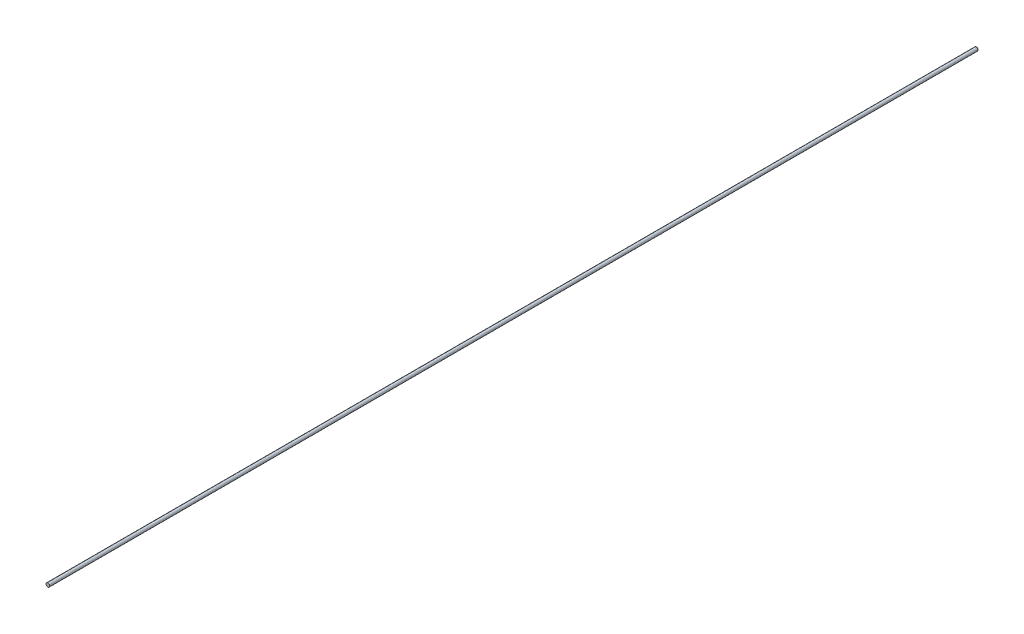
ISO-10303-21;
HEADER;
FILE_DESCRIPTION(('STEP AP214'),'2;1');
FILE_NAME('part.step','',(''),(''),'','','');
FILE_SCHEMA(('AUTOMOTIVE_DESIGN { 1 0 10303 214 1 1 1 1 }'));
ENDSEC;
DATA;
#1=APPLICATION_CONTEXT('core data for automotive mechanical design processes');
#2=APPLICATION_PROTOCOL_DEFINITION('international standard','automotive_design',2000,#1);
#3=PRODUCT_CONTEXT('',#1,'mechanical');
#4=PRODUCT('Part','Part','',(#3));
#5=PRODUCT_RELATED_PRODUCT_CATEGORY('part','',(#4));
#6=PRODUCT_DEFINITION_FORMATION('','',#4);
#7=PRODUCT_DEFINITION_CONTEXT('part definition',#1,'design');
#8=PRODUCT_DEFINITION('design','',#6,#7);
#9=PRODUCT_DEFINITION_SHAPE('','',#8);
#10=(LENGTH_UNIT() NAMED_UNIT(*) SI_UNIT(.MILLI.,.METRE.));
#11=(NAMED_UNIT(*) PLANE_ANGLE_UNIT() SI_UNIT($,.RADIAN.));
#12=(NAMED_UNIT(*) SI_UNIT($,.STERADIAN.) SOLID_ANGLE_UNIT());
#13=UNCERTAINTY_MEASURE_WITH_UNIT(LENGTH_MEASURE(1.E-05),#10,'distance_accuracy_value','');
#14=(GEOMETRIC_REPRESENTATION_CONTEXT(3) GLOBAL_UNCERTAINTY_ASSIGNED_CONTEXT((#13)) GLOBAL_UNIT_ASSIGNED_CONTEXT((#10,
#11,#12)) REPRESENTATION_CONTEXT('',''));
#15=CARTESIAN_POINT('',(0.,0.,0.));
#16=DIRECTION('',(0.,0.,1.));
#17=DIRECTION('',(1.,0.,0.));
#18=AXIS2_PLACEMENT_3D('',#15,#16,#17);
#19=CARTESIAN_POINT('',(0.,0.,1034.05));
#20=DIRECTION('',(0.,0.,-1.));
#21=DIRECTION('',(-1.,0.,0.));
#22=AXIS2_PLACEMENT_3D('',#19,#20,#21);
#23=CYLINDRICAL_SURFACE('',#22,2.);
#24=CARTESIAN_POINT('',(0.,0.,0.38999999999989));
#25=DIRECTION('',(0.,0.,1.));
#26=DIRECTION('',(1.,0.,0.));
#27=AXIS2_PLACEMENT_3D('',#24,#25,#26);
#28=CIRCLE('',#27,1.99999999999989);
#29=CARTESIAN_POINT('',(1.99999999999989,0.,0.38999999999989));
#30=VERTEX_POINT('',#29);
#31=EDGE_CURVE('E44',#30,#30,#28,.T.);
#32=ORIENTED_EDGE('',*,*,#31,.T.);
#33=EDGE_LOOP('',(#32));
#34=FACE_BOUND('',#33,.T.);
#35=CARTESIAN_POINT('',(0.,0.,1034.05));
#36=DIRECTION('',(0.,0.,1.));
#37=DIRECTION('',(1.,0.,0.));
#38=AXIS2_PLACEMENT_3D('',#35,#36,#37);
#39=CIRCLE('',#38,2.);
#40=CARTESIAN_POINT('',(2.,0.,1034.05));
#41=VERTEX_POINT('',#40);
#42=EDGE_CURVE('E10',#41,#41,#39,.T.);
#43=ORIENTED_EDGE('',*,*,#42,.F.);
#44=EDGE_LOOP('',(#43));
#45=FACE_BOUND('',#44,.T.);
#46=ADVANCED_FACE('F38',(#34,#45),#23,.T.);
#47=CARTESIAN_POINT('',(0.,0.,1034.05));
#48=DIRECTION('',(0.,0.,1.));
#49=DIRECTION('',(1.,0.,0.));
#50=AXIS2_PLACEMENT_3D('',#47,#48,#49);
#51=PLANE('',#50);
#52=ORIENTED_EDGE('',*,*,#42,.T.);
#53=EDGE_LOOP('',(#52));
#54=FACE_BOUND('',#53,.T.);
#55=ADVANCED_FACE('F62',(#54),#51,.T.);
#56=CARTESIAN_POINT('',(0.,0.,0.));
#57=DIRECTION('',(0.,0.,1.));
#58=DIRECTION('',(1.,0.,0.));
#59=AXIS2_PLACEMENT_3D('',#56,#57,#58);
#60=CONICAL_SURFACE('',#59,1.61,0.785398163397449);
#61=ORIENTED_EDGE('',*,*,#31,.F.);
#62=EDGE_LOOP('',(#61));
#63=FACE_BOUND('',#62,.T.);
#64=CARTESIAN_POINT('',(0.,0.,0.));
#65=DIRECTION('',(0.,0.,1.));
#66=DIRECTION('',(1.,0.,0.));
#67=AXIS2_PLACEMENT_3D('',#64,#65,#66);
#68=CIRCLE('',#67,1.61);
#69=CARTESIAN_POINT('',(1.61,0.,0.));
#70=VERTEX_POINT('',#69);
#71=EDGE_CURVE('E48',#70,#70,#68,.T.);
#72=ORIENTED_EDGE('',*,*,#71,.T.);
#73=EDGE_LOOP('',(#72));
#74=FACE_BOUND('',#73,.T.);
#75=ADVANCED_FACE('F55',(#63,#74),#60,.T.);
#76=CARTESIAN_POINT('',(0.,0.,0.));
#77=DIRECTION('',(0.,0.,1.));
#78=DIRECTION('',(1.,0.,0.));
#79=AXIS2_PLACEMENT_3D('',#76,#77,#78);
#80=PLANE('',#79);
#81=ORIENTED_EDGE('',*,*,#71,.F.);
#82=EDGE_LOOP('',(#81));
#83=FACE_BOUND('',#82,.T.);
#84=ADVANCED_FACE('F57',(#83),#80,.F.);
#85=CLOSED_SHELL('',(#46,#55,#75,#84));
#86=MANIFOLD_SOLID_BREP('B2',#85);
#87=ADVANCED_BREP_SHAPE_REPRESENTATION('',(#18,#86),#14);
#88=SHAPE_DEFINITION_REPRESENTATION(#9,#87);
ENDSEC;
END-ISO-10303-21;
